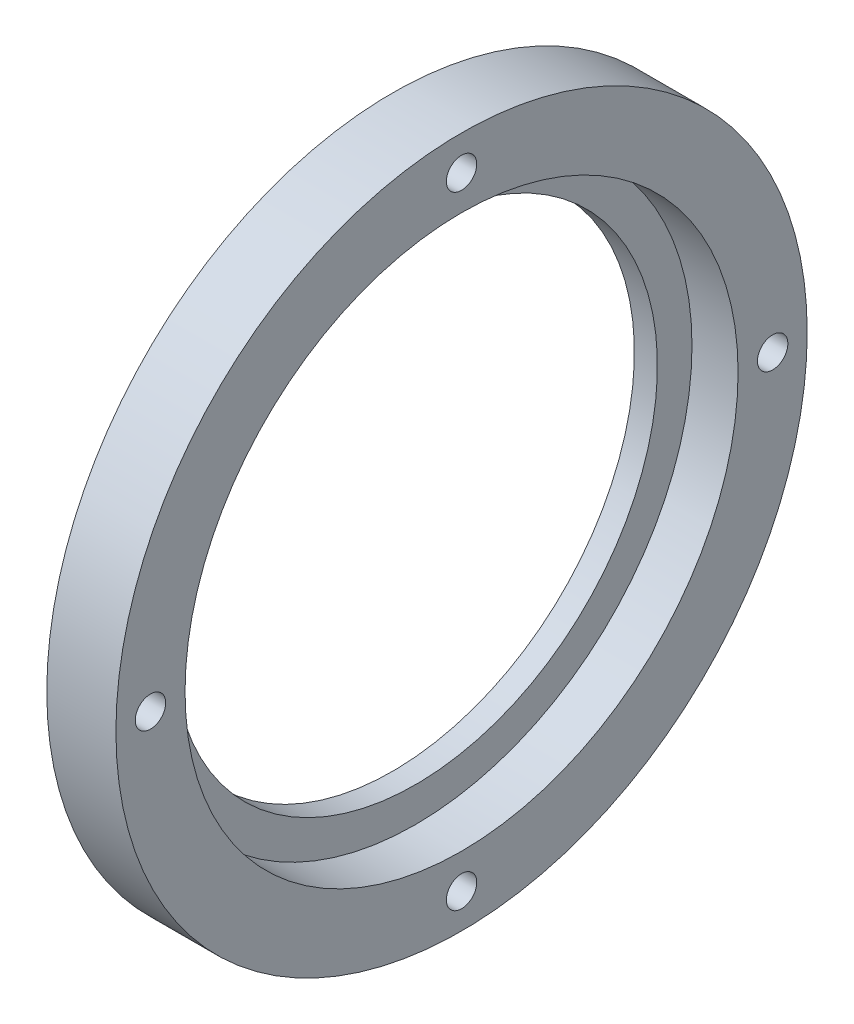
ISO-10303-21;
HEADER;
FILE_DESCRIPTION(('STEP AP214'),'2;1');
FILE_NAME('part.step','',(''),(''),'','','');
FILE_SCHEMA(('AUTOMOTIVE_DESIGN { 1 0 10303 214 1 1 1 1 }'));
ENDSEC;
DATA;
#1=APPLICATION_CONTEXT('core data for automotive mechanical design processes');
#2=APPLICATION_PROTOCOL_DEFINITION('international standard','automotive_design',2000,#1);
#3=PRODUCT_CONTEXT('',#1,'mechanical');
#4=PRODUCT('Part','Part','',(#3));
#5=PRODUCT_RELATED_PRODUCT_CATEGORY('part','',(#4));
#6=PRODUCT_DEFINITION_FORMATION('','',#4);
#7=PRODUCT_DEFINITION_CONTEXT('part definition',#1,'design');
#8=PRODUCT_DEFINITION('design','',#6,#7);
#9=PRODUCT_DEFINITION_SHAPE('','',#8);
#10=(LENGTH_UNIT() NAMED_UNIT(*) SI_UNIT(.MILLI.,.METRE.));
#11=(NAMED_UNIT(*) PLANE_ANGLE_UNIT() SI_UNIT($,.RADIAN.));
#12=(NAMED_UNIT(*) SI_UNIT($,.STERADIAN.) SOLID_ANGLE_UNIT());
#13=UNCERTAINTY_MEASURE_WITH_UNIT(LENGTH_MEASURE(1.E-05),#10,'distance_accuracy_value','');
#14=(GEOMETRIC_REPRESENTATION_CONTEXT(3) GLOBAL_UNCERTAINTY_ASSIGNED_CONTEXT((#13)) GLOBAL_UNIT_ASSIGNED_CONTEXT((#10,
#11,#12)) REPRESENTATION_CONTEXT('',''));
#15=CARTESIAN_POINT('',(0.,0.,0.));
#16=DIRECTION('',(0.,0.,1.));
#17=DIRECTION('',(1.,0.,0.));
#18=AXIS2_PLACEMENT_3D('',#15,#16,#17);
#19=CARTESIAN_POINT('',(-16.7088779284834,0.,0.));
#20=DIRECTION('',(-1.,0.,0.));
#21=DIRECTION('',(0.,0.,1.));
#22=AXIS2_PLACEMENT_3D('',#19,#20,#21);
#23=CYLINDRICAL_SURFACE('',#22,52.5);
#24=CARTESIAN_POINT('',(5.,0.,0.));
#25=DIRECTION('',(-1.,0.,0.));
#26=DIRECTION('',(0.,0.,1.));
#27=AXIS2_PLACEMENT_3D('',#24,#25,#26);
#28=CIRCLE('',#27,52.5);
#29=CARTESIAN_POINT('',(5.,0.,52.5));
#30=VERTEX_POINT('',#29);
#31=EDGE_CURVE('E53',#30,#30,#28,.T.);
#32=ORIENTED_EDGE('',*,*,#31,.F.);
#33=EDGE_LOOP('',(#32));
#34=FACE_BOUND('',#33,.T.);
#35=CARTESIAN_POINT('',(0.,0.,0.));
#36=DIRECTION('',(-1.,0.,0.));
#37=DIRECTION('',(0.,0.,1.));
#38=AXIS2_PLACEMENT_3D('',#35,#36,#37);
#39=CIRCLE('',#38,52.5);
#40=CARTESIAN_POINT('',(0.,0.,52.5));
#41=VERTEX_POINT('',#40);
#42=EDGE_CURVE('E10',#41,#41,#39,.T.);
#43=ORIENTED_EDGE('',*,*,#42,.T.);
#44=EDGE_LOOP('',(#43));
#45=FACE_BOUND('',#44,.T.);
#46=ADVANCED_FACE('F31',(#34,#45),#23,.F.);
#47=CARTESIAN_POINT('',(0.,52.5,0.));
#48=DIRECTION('',(1.,0.,0.));
#49=DIRECTION('',(0.,0.,-1.));
#50=AXIS2_PLACEMENT_3D('',#47,#48,#49);
#51=PLANE('',#50);
#52=CARTESIAN_POINT('',(0.,67.5,0.));
#53=DIRECTION('',(-1.,0.,0.));
#54=DIRECTION('',(0.,0.,1.));
#55=AXIS2_PLACEMENT_3D('',#52,#53,#54);
#56=CIRCLE('',#55,3.29999999999998);
#57=CARTESIAN_POINT('',(0.,67.5,3.29999999999998));
#58=VERTEX_POINT('',#57);
#59=EDGE_CURVE('E74',#58,#58,#56,.T.);
#60=ORIENTED_EDGE('',*,*,#59,.F.);
#61=EDGE_LOOP('',(#60));
#62=FACE_BOUND('',#61,.T.);
#63=CARTESIAN_POINT('',(0.,0.,67.5));
#64=DIRECTION('',(-1.,0.,0.));
#65=DIRECTION('',(0.,0.,1.));
#66=AXIS2_PLACEMENT_3D('',#63,#64,#65);
#67=CIRCLE('',#66,3.29999999999999);
#68=CARTESIAN_POINT('',(0.,0.,70.8));
#69=VERTEX_POINT('',#68);
#70=EDGE_CURVE('E68',#69,#69,#67,.T.);
#71=ORIENTED_EDGE('',*,*,#70,.F.);
#72=EDGE_LOOP('',(#71));
#73=FACE_BOUND('',#72,.T.);
#74=CARTESIAN_POINT('',(0.,-67.5,0.));
#75=DIRECTION('',(-1.,0.,0.));
#76=DIRECTION('',(0.,0.,1.));
#77=AXIS2_PLACEMENT_3D('',#74,#75,#76);
#78=CIRCLE('',#77,3.29999999999998);
#79=CARTESIAN_POINT('',(0.,-67.5,3.29999999999998));
#80=VERTEX_POINT('',#79);
#81=EDGE_CURVE('E62',#80,#80,#78,.T.);
#82=ORIENTED_EDGE('',*,*,#81,.F.);
#83=EDGE_LOOP('',(#82));
#84=FACE_BOUND('',#83,.T.);
#85=CARTESIAN_POINT('',(0.,0.,-67.5));
#86=DIRECTION('',(-1.,0.,0.));
#87=DIRECTION('',(0.,0.,1.));
#88=AXIS2_PLACEMENT_3D('',#85,#86,#87);
#89=CIRCLE('',#88,3.29999999999999);
#90=CARTESIAN_POINT('',(0.,0.,-64.2));
#91=VERTEX_POINT('',#90);
#92=EDGE_CURVE('E56',#91,#91,#89,.T.);
#93=ORIENTED_EDGE('',*,*,#92,.F.);
#94=EDGE_LOOP('',(#93));
#95=FACE_BOUND('',#94,.T.);
#96=ORIENTED_EDGE('',*,*,#42,.F.);
#97=EDGE_LOOP('',(#96));
#98=FACE_BOUND('',#97,.T.);
#99=CARTESIAN_POINT('',(0.,0.,0.));
#100=DIRECTION('',(-1.,0.,0.));
#101=DIRECTION('',(0.,0.,1.));
#102=AXIS2_PLACEMENT_3D('',#99,#100,#101);
#103=CIRCLE('',#102,75.);
#104=CARTESIAN_POINT('',(0.,0.,75.));
#105=VERTEX_POINT('',#104);
#106=EDGE_CURVE('E37',#105,#105,#103,.T.);
#107=ORIENTED_EDGE('',*,*,#106,.T.);
#108=EDGE_LOOP('',(#107));
#109=FACE_BOUND('',#108,.T.);
#110=ADVANCED_FACE('F91',(#62,#73,#84,#95,#98,#109),#51,.F.);
#111=CARTESIAN_POINT('',(-16.7088779284834,0.,0.));
#112=DIRECTION('',(-1.,0.,0.));
#113=DIRECTION('',(0.,0.,1.));
#114=AXIS2_PLACEMENT_3D('',#111,#112,#113);
#115=CYLINDRICAL_SURFACE('',#114,75.);
#116=ORIENTED_EDGE('',*,*,#106,.F.);
#117=EDGE_LOOP('',(#116));
#118=FACE_BOUND('',#117,.T.);
#119=CARTESIAN_POINT('',(15.,0.,0.));
#120=DIRECTION('',(-1.,0.,0.));
#121=DIRECTION('',(0.,0.,1.));
#122=AXIS2_PLACEMENT_3D('',#119,#120,#121);
#123=CIRCLE('',#122,75.);
#124=CARTESIAN_POINT('',(15.,0.,75.));
#125=VERTEX_POINT('',#124);
#126=EDGE_CURVE('E41',#125,#125,#123,.T.);
#127=ORIENTED_EDGE('',*,*,#126,.T.);
#128=EDGE_LOOP('',(#127));
#129=FACE_BOUND('',#128,.T.);
#130=ADVANCED_FACE('F94',(#118,#129),#115,.T.);
#131=CARTESIAN_POINT('',(15.,75.,0.));
#132=DIRECTION('',(-1.,0.,0.));
#133=DIRECTION('',(0.,0.,1.));
#134=AXIS2_PLACEMENT_3D('',#131,#132,#133);
#135=PLANE('',#134);
#136=CARTESIAN_POINT('',(15.,67.5,0.));
#137=DIRECTION('',(-1.,0.,0.));
#138=DIRECTION('',(0.,0.,1.));
#139=AXIS2_PLACEMENT_3D('',#136,#137,#138);
#140=CIRCLE('',#139,3.3);
#141=CARTESIAN_POINT('',(15.,67.5,3.3));
#142=VERTEX_POINT('',#141);
#143=EDGE_CURVE('E77',#142,#142,#140,.T.);
#144=ORIENTED_EDGE('',*,*,#143,.T.);
#145=EDGE_LOOP('',(#144));
#146=FACE_BOUND('',#145,.T.);
#147=CARTESIAN_POINT('',(15.,0.,67.5));
#148=DIRECTION('',(-1.,0.,0.));
#149=DIRECTION('',(0.,0.,1.));
#150=AXIS2_PLACEMENT_3D('',#147,#148,#149);
#151=CIRCLE('',#150,3.3);
#152=CARTESIAN_POINT('',(15.,0.,70.8));
#153=VERTEX_POINT('',#152);
#154=EDGE_CURVE('E71',#153,#153,#151,.T.);
#155=ORIENTED_EDGE('',*,*,#154,.T.);
#156=EDGE_LOOP('',(#155));
#157=FACE_BOUND('',#156,.T.);
#158=CARTESIAN_POINT('',(15.,-67.5,0.));
#159=DIRECTION('',(-1.,0.,0.));
#160=DIRECTION('',(0.,0.,1.));
#161=AXIS2_PLACEMENT_3D('',#158,#159,#160);
#162=CIRCLE('',#161,3.3);
#163=CARTESIAN_POINT('',(15.,-67.5,3.3));
#164=VERTEX_POINT('',#163);
#165=EDGE_CURVE('E65',#164,#164,#162,.T.);
#166=ORIENTED_EDGE('',*,*,#165,.T.);
#167=EDGE_LOOP('',(#166));
#168=FACE_BOUND('',#167,.T.);
#169=CARTESIAN_POINT('',(15.,0.,-67.5));
#170=DIRECTION('',(-1.,0.,0.));
#171=DIRECTION('',(0.,0.,1.));
#172=AXIS2_PLACEMENT_3D('',#169,#170,#171);
#173=CIRCLE('',#172,3.3);
#174=CARTESIAN_POINT('',(15.,0.,-64.2));
#175=VERTEX_POINT('',#174);
#176=EDGE_CURVE('E59',#175,#175,#173,.T.);
#177=ORIENTED_EDGE('',*,*,#176,.T.);
#178=EDGE_LOOP('',(#177));
#179=FACE_BOUND('',#178,.T.);
#180=ORIENTED_EDGE('',*,*,#126,.F.);
#181=EDGE_LOOP('',(#180));
#182=FACE_BOUND('',#181,.T.);
#183=CARTESIAN_POINT('',(15.,0.,0.));
#184=DIRECTION('',(-1.,0.,0.));
#185=DIRECTION('',(0.,0.,1.));
#186=AXIS2_PLACEMENT_3D('',#183,#184,#185);
#187=CIRCLE('',#186,60.);
#188=CARTESIAN_POINT('',(15.,0.,60.));
#189=VERTEX_POINT('',#188);
#190=EDGE_CURVE('E45',#189,#189,#187,.T.);
#191=ORIENTED_EDGE('',*,*,#190,.T.);
#192=EDGE_LOOP('',(#191));
#193=FACE_BOUND('',#192,.T.);
#194=ADVANCED_FACE('F81',(#146,#157,#168,#179,#182,#193),#135,.F.);
#195=CARTESIAN_POINT('',(-16.7088779284834,0.,0.));
#196=DIRECTION('',(-1.,0.,0.));
#197=DIRECTION('',(0.,0.,1.));
#198=AXIS2_PLACEMENT_3D('',#195,#196,#197);
#199=CYLINDRICAL_SURFACE('',#198,60.);
#200=ORIENTED_EDGE('',*,*,#190,.F.);
#201=EDGE_LOOP('',(#200));
#202=FACE_BOUND('',#201,.T.);
#203=CARTESIAN_POINT('',(5.,0.,0.));
#204=DIRECTION('',(-1.,0.,0.));
#205=DIRECTION('',(0.,0.,1.));
#206=AXIS2_PLACEMENT_3D('',#203,#204,#205);
#207=CIRCLE('',#206,60.);
#208=CARTESIAN_POINT('',(5.,0.,60.));
#209=VERTEX_POINT('',#208);
#210=EDGE_CURVE('E50',#209,#209,#207,.T.);
#211=ORIENTED_EDGE('',*,*,#210,.T.);
#212=EDGE_LOOP('',(#211));
#213=FACE_BOUND('',#212,.T.);
#214=ADVANCED_FACE('F114',(#202,#213),#199,.F.);
#215=CARTESIAN_POINT('',(5.,60.,0.));
#216=DIRECTION('',(-1.,0.,0.));
#217=DIRECTION('',(0.,0.,1.));
#218=AXIS2_PLACEMENT_3D('',#215,#216,#217);
#219=PLANE('',#218);
#220=ORIENTED_EDGE('',*,*,#210,.F.);
#221=EDGE_LOOP('',(#220));
#222=FACE_BOUND('',#221,.T.);
#223=ORIENTED_EDGE('',*,*,#31,.T.);
#224=EDGE_LOOP('',(#223));
#225=FACE_BOUND('',#224,.T.);
#226=ADVANCED_FACE('F105',(#222,#225),#219,.F.);
#227=CARTESIAN_POINT('',(0.,0.,-67.5));
#228=DIRECTION('',(-1.,0.,0.));
#229=DIRECTION('',(0.,0.,1.));
#230=AXIS2_PLACEMENT_3D('',#227,#228,#229);
#231=CYLINDRICAL_SURFACE('',#230,3.29999999999999);
#232=ORIENTED_EDGE('',*,*,#176,.F.);
#233=EDGE_LOOP('',(#232));
#234=FACE_BOUND('',#233,.T.);
#235=ORIENTED_EDGE('',*,*,#92,.T.);
#236=EDGE_LOOP('',(#235));
#237=FACE_BOUND('',#236,.T.);
#238=ADVANCED_FACE('F102',(#234,#237),#231,.F.);
#239=CARTESIAN_POINT('',(0.,-67.5,0.));
#240=DIRECTION('',(-1.,0.,0.));
#241=DIRECTION('',(0.,0.,1.));
#242=AXIS2_PLACEMENT_3D('',#239,#240,#241);
#243=CYLINDRICAL_SURFACE('',#242,3.29999999999999);
#244=ORIENTED_EDGE('',*,*,#165,.F.);
#245=EDGE_LOOP('',(#244));
#246=FACE_BOUND('',#245,.T.);
#247=ORIENTED_EDGE('',*,*,#81,.T.);
#248=EDGE_LOOP('',(#247));
#249=FACE_BOUND('',#248,.T.);
#250=ADVANCED_FACE('F104',(#246,#249),#243,.F.);
#251=CARTESIAN_POINT('',(0.,0.,67.5));
#252=DIRECTION('',(-1.,0.,0.));
#253=DIRECTION('',(0.,0.,1.));
#254=AXIS2_PLACEMENT_3D('',#251,#252,#253);
#255=CYLINDRICAL_SURFACE('',#254,3.29999999999999);
#256=ORIENTED_EDGE('',*,*,#154,.F.);
#257=EDGE_LOOP('',(#256));
#258=FACE_BOUND('',#257,.T.);
#259=ORIENTED_EDGE('',*,*,#70,.T.);
#260=EDGE_LOOP('',(#259));
#261=FACE_BOUND('',#260,.T.);
#262=ADVANCED_FACE('F87',(#258,#261),#255,.F.);
#263=CARTESIAN_POINT('',(0.,67.5,0.));
#264=DIRECTION('',(-1.,0.,0.));
#265=DIRECTION('',(0.,0.,1.));
#266=AXIS2_PLACEMENT_3D('',#263,#264,#265);
#267=CYLINDRICAL_SURFACE('',#266,3.29999999999999);
#268=ORIENTED_EDGE('',*,*,#143,.F.);
#269=EDGE_LOOP('',(#268));
#270=FACE_BOUND('',#269,.T.);
#271=ORIENTED_EDGE('',*,*,#59,.T.);
#272=EDGE_LOOP('',(#271));
#273=FACE_BOUND('',#272,.T.);
#274=ADVANCED_FACE('F84',(#270,#273),#267,.F.);
#275=CLOSED_SHELL('',(#46,#110,#130,#194,#214,#226,#238,#250,#262,#274));
#276=MANIFOLD_SOLID_BREP('B2',#275);
#277=ADVANCED_BREP_SHAPE_REPRESENTATION('',(#18,#276),#14);
#278=SHAPE_DEFINITION_REPRESENTATION(#9,#277);
ENDSEC;
END-ISO-10303-21;
